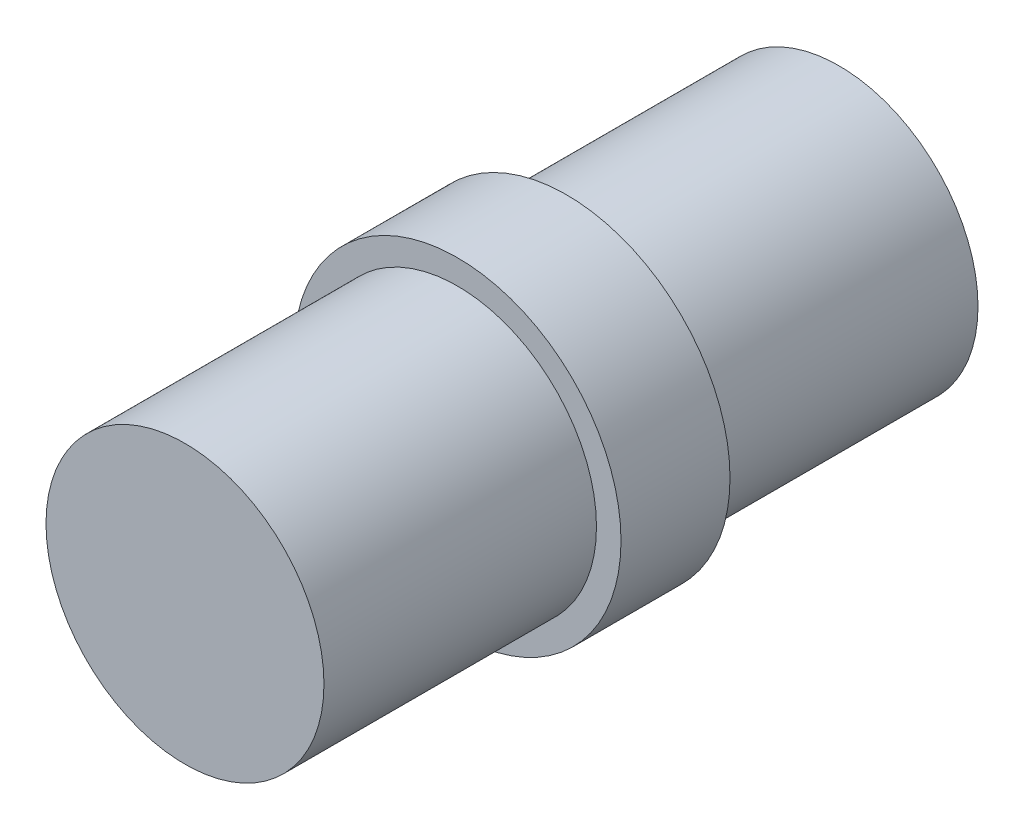
ISO-10303-21;
HEADER;
FILE_DESCRIPTION(('STEP AP214'),'2;1');
FILE_NAME('part.step','',(''),(''),'','','');
FILE_SCHEMA(('AUTOMOTIVE_DESIGN { 1 0 10303 214 1 1 1 1 }'));
ENDSEC;
DATA;
#1=APPLICATION_CONTEXT('core data for automotive mechanical design processes');
#2=APPLICATION_PROTOCOL_DEFINITION('international standard','automotive_design',2000,#1);
#3=PRODUCT_CONTEXT('',#1,'mechanical');
#4=PRODUCT('Part','Part','',(#3));
#5=PRODUCT_RELATED_PRODUCT_CATEGORY('part','',(#4));
#6=PRODUCT_DEFINITION_FORMATION('','',#4);
#7=PRODUCT_DEFINITION_CONTEXT('part definition',#1,'design');
#8=PRODUCT_DEFINITION('design','',#6,#7);
#9=PRODUCT_DEFINITION_SHAPE('','',#8);
#10=(LENGTH_UNIT() NAMED_UNIT(*) SI_UNIT(.MILLI.,.METRE.));
#11=(NAMED_UNIT(*) PLANE_ANGLE_UNIT() SI_UNIT($,.RADIAN.));
#12=(NAMED_UNIT(*) SI_UNIT($,.STERADIAN.) SOLID_ANGLE_UNIT());
#13=UNCERTAINTY_MEASURE_WITH_UNIT(LENGTH_MEASURE(1.E-05),#10,'distance_accuracy_value','');
#14=(GEOMETRIC_REPRESENTATION_CONTEXT(3) GLOBAL_UNCERTAINTY_ASSIGNED_CONTEXT((#13)) GLOBAL_UNIT_ASSIGNED_CONTEXT((#10,
#11,#12)) REPRESENTATION_CONTEXT('',''));
#15=CARTESIAN_POINT('',(0.,0.,0.));
#16=DIRECTION('',(0.,0.,1.));
#17=DIRECTION('',(1.,0.,0.));
#18=AXIS2_PLACEMENT_3D('',#15,#16,#17);
#19=CARTESIAN_POINT('',(0.,0.,5.));
#20=DIRECTION('',(0.,0.,-1.));
#21=DIRECTION('',(-1.,0.,0.));
#22=AXIS2_PLACEMENT_3D('',#19,#20,#21);
#23=CYLINDRICAL_SURFACE('',#22,2.55);
#24=CARTESIAN_POINT('',(0.,0.,5.));
#25=DIRECTION('',(0.,0.,1.));
#26=DIRECTION('',(1.,0.,0.));
#27=AXIS2_PLACEMENT_3D('',#24,#25,#26);
#28=CIRCLE('',#27,2.55);
#29=CARTESIAN_POINT('',(2.55,0.,5.));
#30=VERTEX_POINT('',#29);
#31=EDGE_CURVE('E10',#30,#30,#28,.T.);
#32=ORIENTED_EDGE('',*,*,#31,.F.);
#33=EDGE_LOOP('',(#32));
#34=FACE_BOUND('',#33,.T.);
#35=CARTESIAN_POINT('',(0.,0.,0.));
#36=DIRECTION('',(0.,0.,1.));
#37=DIRECTION('',(1.,0.,0.));
#38=AXIS2_PLACEMENT_3D('',#35,#36,#37);
#39=CIRCLE('',#38,2.55);
#40=CARTESIAN_POINT('',(2.55,0.,0.));
#41=VERTEX_POINT('',#40);
#42=EDGE_CURVE('E38',#41,#41,#39,.T.);
#43=ORIENTED_EDGE('',*,*,#42,.T.);
#44=EDGE_LOOP('',(#43));
#45=FACE_BOUND('',#44,.T.);
#46=ADVANCED_FACE('F35',(#34,#45),#23,.T.);
#47=CARTESIAN_POINT('',(0.,0.,5.));
#48=DIRECTION('',(0.,0.,1.));
#49=DIRECTION('',(1.,0.,0.));
#50=AXIS2_PLACEMENT_3D('',#47,#48,#49);
#51=PLANE('',#50);
#52=ORIENTED_EDGE('',*,*,#31,.T.);
#53=EDGE_LOOP('',(#52));
#54=FACE_BOUND('',#53,.T.);
#55=ADVANCED_FACE('F71',(#54),#51,.T.);
#56=CARTESIAN_POINT('',(0.,0.,-2.));
#57=DIRECTION('',(0.,0.,1.));
#58=DIRECTION('',(1.,0.,0.));
#59=AXIS2_PLACEMENT_3D('',#56,#57,#58);
#60=CYLINDRICAL_SURFACE('',#59,3.);
#61=CARTESIAN_POINT('',(0.,0.,-2.));
#62=DIRECTION('',(0.,0.,1.));
#63=DIRECTION('',(1.,0.,0.));
#64=AXIS2_PLACEMENT_3D('',#61,#62,#63);
#65=CIRCLE('',#64,3.);
#66=CARTESIAN_POINT('',(3.,0.,-2.));
#67=VERTEX_POINT('',#66);
#68=EDGE_CURVE('E45',#67,#67,#65,.T.);
#69=ORIENTED_EDGE('',*,*,#68,.T.);
#70=EDGE_LOOP('',(#69));
#71=FACE_BOUND('',#70,.T.);
#72=CARTESIAN_POINT('',(0.,0.,0.));
#73=DIRECTION('',(0.,0.,1.));
#74=DIRECTION('',(1.,0.,0.));
#75=AXIS2_PLACEMENT_3D('',#72,#73,#74);
#76=CIRCLE('',#75,3.);
#77=CARTESIAN_POINT('',(3.,0.,0.));
#78=VERTEX_POINT('',#77);
#79=EDGE_CURVE('E47',#78,#78,#76,.T.);
#80=ORIENTED_EDGE('',*,*,#79,.F.);
#81=EDGE_LOOP('',(#80));
#82=FACE_BOUND('',#81,.T.);
#83=ADVANCED_FACE('F76',(#71,#82),#60,.T.);
#84=CARTESIAN_POINT('',(0.,0.,-2.));
#85=DIRECTION('',(0.,0.,1.));
#86=DIRECTION('',(1.,0.,0.));
#87=AXIS2_PLACEMENT_3D('',#84,#85,#86);
#88=PLANE('',#87);
#89=CARTESIAN_POINT('',(0.,0.,-2.));
#90=DIRECTION('',(0.,0.,1.));
#91=DIRECTION('',(1.,0.,0.));
#92=AXIS2_PLACEMENT_3D('',#89,#90,#91);
#93=CIRCLE('',#92,2.55);
#94=CARTESIAN_POINT('',(2.55,0.,-2.));
#95=VERTEX_POINT('',#94);
#96=EDGE_CURVE('E53',#95,#95,#93,.T.);
#97=ORIENTED_EDGE('',*,*,#96,.T.);
#98=EDGE_LOOP('',(#97));
#99=FACE_BOUND('',#98,.T.);
#100=ORIENTED_EDGE('',*,*,#68,.F.);
#101=EDGE_LOOP('',(#100));
#102=FACE_BOUND('',#101,.T.);
#103=ADVANCED_FACE('F82',(#99,#102),#88,.F.);
#104=CARTESIAN_POINT('',(0.,0.,0.));
#105=DIRECTION('',(0.,0.,1.));
#106=DIRECTION('',(1.,0.,0.));
#107=AXIS2_PLACEMENT_3D('',#104,#105,#106);
#108=PLANE('',#107);
#109=ORIENTED_EDGE('',*,*,#42,.F.);
#110=EDGE_LOOP('',(#109));
#111=FACE_BOUND('',#110,.T.);
#112=ORIENTED_EDGE('',*,*,#79,.T.);
#113=EDGE_LOOP('',(#112));
#114=FACE_BOUND('',#113,.T.);
#115=ADVANCED_FACE('F68',(#111,#114),#108,.T.);
#116=CARTESIAN_POINT('',(0.,0.,-7.));
#117=DIRECTION('',(0.,0.,1.));
#118=DIRECTION('',(1.,0.,0.));
#119=AXIS2_PLACEMENT_3D('',#116,#117,#118);
#120=CYLINDRICAL_SURFACE('',#119,2.55);
#121=CARTESIAN_POINT('',(0.,0.,-7.));
#122=DIRECTION('',(0.,0.,1.));
#123=DIRECTION('',(1.,0.,0.));
#124=AXIS2_PLACEMENT_3D('',#121,#122,#123);
#125=CIRCLE('',#124,2.55);
#126=CARTESIAN_POINT('',(2.55,0.,-7.));
#127=VERTEX_POINT('',#126);
#128=EDGE_CURVE('E50',#127,#127,#125,.T.);
#129=ORIENTED_EDGE('',*,*,#128,.T.);
#130=EDGE_LOOP('',(#129));
#131=FACE_BOUND('',#130,.T.);
#132=ORIENTED_EDGE('',*,*,#96,.F.);
#133=EDGE_LOOP('',(#132));
#134=FACE_BOUND('',#133,.T.);
#135=ADVANCED_FACE('F59',(#131,#134),#120,.T.);
#136=CARTESIAN_POINT('',(0.,0.,-7.));
#137=DIRECTION('',(0.,0.,1.));
#138=DIRECTION('',(1.,0.,0.));
#139=AXIS2_PLACEMENT_3D('',#136,#137,#138);
#140=PLANE('',#139);
#141=ORIENTED_EDGE('',*,*,#128,.F.);
#142=EDGE_LOOP('',(#141));
#143=FACE_BOUND('',#142,.T.);
#144=ADVANCED_FACE('F62',(#143),#140,.F.);
#145=CLOSED_SHELL('',(#46,#55,#83,#103,#115,#135,#144));
#146=MANIFOLD_SOLID_BREP('B2',#145);
#147=ADVANCED_BREP_SHAPE_REPRESENTATION('',(#18,#146),#14);
#148=SHAPE_DEFINITION_REPRESENTATION(#9,#147);
ENDSEC;
END-ISO-10303-21;
